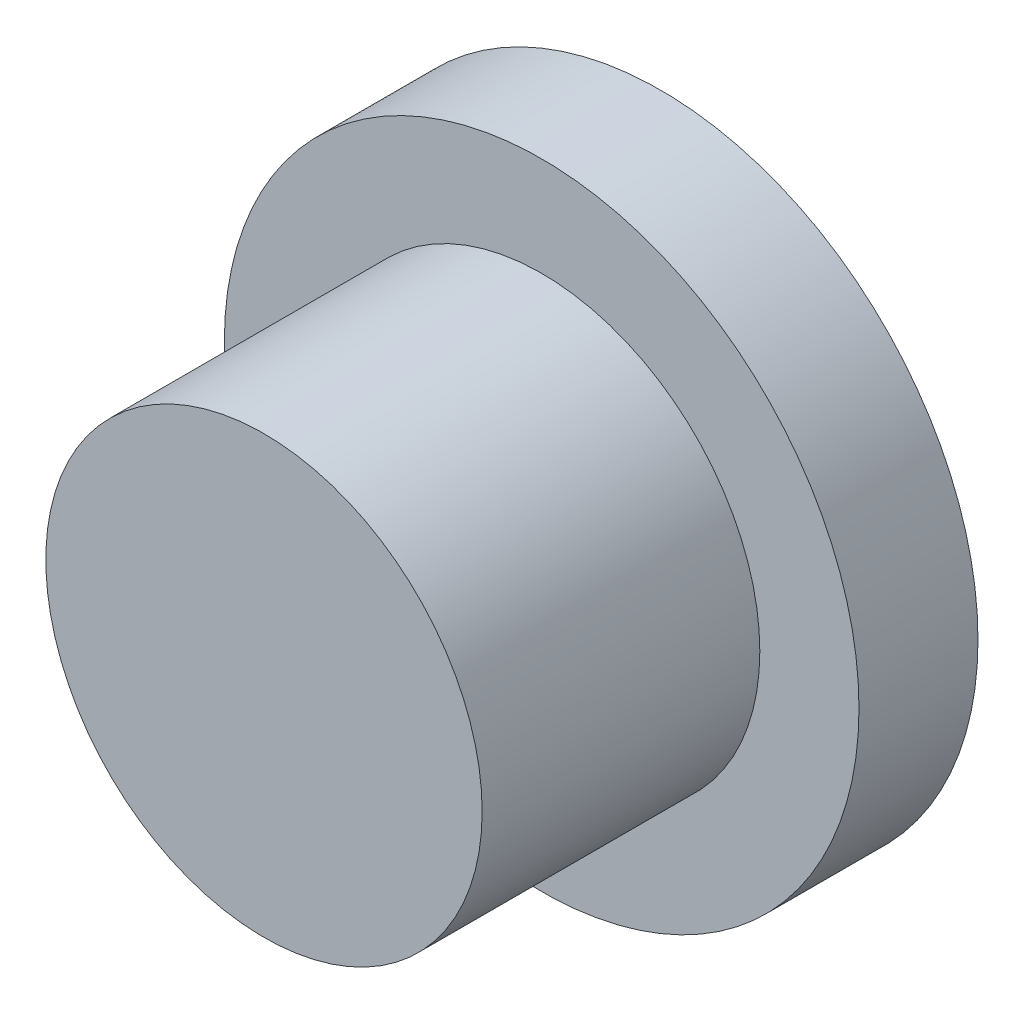
ISO-10303-21;
HEADER;
FILE_DESCRIPTION(('STEP AP214'),'2;1');
FILE_NAME('part.step','',(''),(''),'','','');
FILE_SCHEMA(('AUTOMOTIVE_DESIGN { 1 0 10303 214 1 1 1 1 }'));
ENDSEC;
DATA;
#1=APPLICATION_CONTEXT('core data for automotive mechanical design processes');
#2=APPLICATION_PROTOCOL_DEFINITION('international standard','automotive_design',2000,#1);
#3=PRODUCT_CONTEXT('',#1,'mechanical');
#4=PRODUCT('Part','Part','',(#3));
#5=PRODUCT_RELATED_PRODUCT_CATEGORY('part','',(#4));
#6=PRODUCT_DEFINITION_FORMATION('','',#4);
#7=PRODUCT_DEFINITION_CONTEXT('part definition',#1,'design');
#8=PRODUCT_DEFINITION('design','',#6,#7);
#9=PRODUCT_DEFINITION_SHAPE('','',#8);
#10=(LENGTH_UNIT() NAMED_UNIT(*) SI_UNIT(.MILLI.,.METRE.));
#11=(NAMED_UNIT(*) PLANE_ANGLE_UNIT() SI_UNIT($,.RADIAN.));
#12=(NAMED_UNIT(*) SI_UNIT($,.STERADIAN.) SOLID_ANGLE_UNIT());
#13=UNCERTAINTY_MEASURE_WITH_UNIT(LENGTH_MEASURE(1.E-05),#10,'distance_accuracy_value','');
#14=(GEOMETRIC_REPRESENTATION_CONTEXT(3) GLOBAL_UNCERTAINTY_ASSIGNED_CONTEXT((#13)) GLOBAL_UNIT_ASSIGNED_CONTEXT((#10,
#11,#12)) REPRESENTATION_CONTEXT('',''));
#15=CARTESIAN_POINT('',(0.,0.,0.));
#16=DIRECTION('',(0.,0.,1.));
#17=DIRECTION('',(1.,0.,0.));
#18=AXIS2_PLACEMENT_3D('',#15,#16,#17);
#19=CARTESIAN_POINT('',(0.,0.,20.));
#20=DIRECTION('',(0.,0.,-1.));
#21=DIRECTION('',(-1.,0.,0.));
#22=AXIS2_PLACEMENT_3D('',#19,#20,#21);
#23=CYLINDRICAL_SURFACE('',#22,11.);
#24=CARTESIAN_POINT('',(0.,0.,6.));
#25=DIRECTION('',(0.,0.,1.));
#26=DIRECTION('',(1.,0.,0.));
#27=AXIS2_PLACEMENT_3D('',#24,#25,#26);
#28=CIRCLE('',#27,11.);
#29=CARTESIAN_POINT('',(11.,0.,6.));
#30=VERTEX_POINT('',#29);
#31=EDGE_CURVE('E42',#30,#30,#28,.T.);
#32=ORIENTED_EDGE('',*,*,#31,.T.);
#33=EDGE_LOOP('',(#32));
#34=FACE_BOUND('',#33,.T.);
#35=CARTESIAN_POINT('',(0.,0.,20.));
#36=DIRECTION('',(0.,0.,1.));
#37=DIRECTION('',(1.,0.,0.));
#38=AXIS2_PLACEMENT_3D('',#35,#36,#37);
#39=CIRCLE('',#38,11.);
#40=CARTESIAN_POINT('',(11.,0.,20.));
#41=VERTEX_POINT('',#40);
#42=EDGE_CURVE('E10',#41,#41,#39,.T.);
#43=ORIENTED_EDGE('',*,*,#42,.F.);
#44=EDGE_LOOP('',(#43));
#45=FACE_BOUND('',#44,.T.);
#46=ADVANCED_FACE('F41',(#34,#45),#23,.T.);
#47=CARTESIAN_POINT('',(0.,0.,20.));
#48=DIRECTION('',(0.,0.,1.));
#49=DIRECTION('',(1.,0.,0.));
#50=AXIS2_PLACEMENT_3D('',#47,#48,#49);
#51=PLANE('',#50);
#52=ORIENTED_EDGE('',*,*,#42,.T.);
#53=EDGE_LOOP('',(#52));
#54=FACE_BOUND('',#53,.T.);
#55=ADVANCED_FACE('F61',(#54),#51,.T.);
#56=CARTESIAN_POINT('',(0.,0.,6.));
#57=DIRECTION('',(0.,0.,-1.));
#58=DIRECTION('',(-1.,0.,0.));
#59=AXIS2_PLACEMENT_3D('',#56,#57,#58);
#60=CYLINDRICAL_SURFACE('',#59,16.);
#61=CARTESIAN_POINT('',(0.,0.,6.));
#62=DIRECTION('',(0.,0.,1.));
#63=DIRECTION('',(1.,0.,0.));
#64=AXIS2_PLACEMENT_3D('',#61,#62,#63);
#65=CIRCLE('',#64,16.);
#66=CARTESIAN_POINT('',(16.,0.,6.));
#67=VERTEX_POINT('',#66);
#68=EDGE_CURVE('E51',#67,#67,#65,.T.);
#69=ORIENTED_EDGE('',*,*,#68,.F.);
#70=EDGE_LOOP('',(#69));
#71=FACE_BOUND('',#70,.T.);
#72=CARTESIAN_POINT('',(0.,0.,0.));
#73=DIRECTION('',(0.,0.,1.));
#74=DIRECTION('',(1.,0.,0.));
#75=AXIS2_PLACEMENT_3D('',#72,#73,#74);
#76=CIRCLE('',#75,16.);
#77=CARTESIAN_POINT('',(16.,0.,0.));
#78=VERTEX_POINT('',#77);
#79=EDGE_CURVE('E52',#78,#78,#76,.T.);
#80=ORIENTED_EDGE('',*,*,#79,.T.);
#81=EDGE_LOOP('',(#80));
#82=FACE_BOUND('',#81,.T.);
#83=ADVANCED_FACE('F62',(#71,#82),#60,.T.);
#84=CARTESIAN_POINT('',(0.,0.,6.));
#85=DIRECTION('',(0.,0.,1.));
#86=DIRECTION('',(1.,0.,0.));
#87=AXIS2_PLACEMENT_3D('',#84,#85,#86);
#88=PLANE('',#87);
#89=ORIENTED_EDGE('',*,*,#31,.F.);
#90=EDGE_LOOP('',(#89));
#91=FACE_BOUND('',#90,.T.);
#92=ORIENTED_EDGE('',*,*,#68,.T.);
#93=EDGE_LOOP('',(#92));
#94=FACE_BOUND('',#93,.T.);
#95=ADVANCED_FACE('F56',(#91,#94),#88,.T.);
#96=CARTESIAN_POINT('',(0.,0.,0.));
#97=DIRECTION('',(0.,0.,1.));
#98=DIRECTION('',(1.,0.,0.));
#99=AXIS2_PLACEMENT_3D('',#96,#97,#98);
#100=PLANE('',#99);
#101=ORIENTED_EDGE('',*,*,#79,.F.);
#102=EDGE_LOOP('',(#101));
#103=FACE_BOUND('',#102,.T.);
#104=ADVANCED_FACE('F67',(#103),#100,.F.);
#105=CLOSED_SHELL('',(#46,#55,#83,#95,#104));
#106=MANIFOLD_SOLID_BREP('B2',#105);
#107=ADVANCED_BREP_SHAPE_REPRESENTATION('',(#18,#106),#14);
#108=SHAPE_DEFINITION_REPRESENTATION(#9,#107);
ENDSEC;
END-ISO-10303-21;
